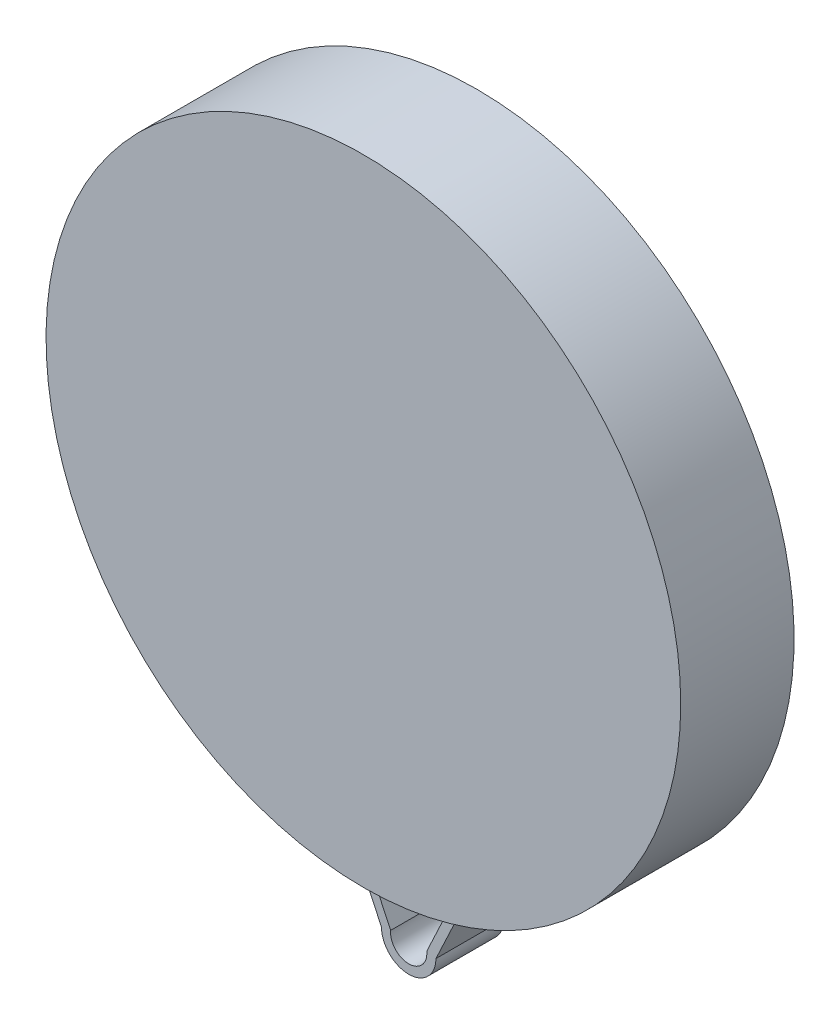
ISO-10303-21;
HEADER;
FILE_DESCRIPTION(('STEP AP214'),'2;1');
FILE_NAME('part.step','',(''),(''),'','','');
FILE_SCHEMA(('AUTOMOTIVE_DESIGN { 1 0 10303 214 1 1 1 1 }'));
ENDSEC;
DATA;
#1=APPLICATION_CONTEXT('core data for automotive mechanical design processes');
#2=APPLICATION_PROTOCOL_DEFINITION('international standard','automotive_design',2000,#1);
#3=PRODUCT_CONTEXT('',#1,'mechanical');
#4=PRODUCT('Part','Part','',(#3));
#5=PRODUCT_RELATED_PRODUCT_CATEGORY('part','',(#4));
#6=PRODUCT_DEFINITION_FORMATION('','',#4);
#7=PRODUCT_DEFINITION_CONTEXT('part definition',#1,'design');
#8=PRODUCT_DEFINITION('design','',#6,#7);
#9=PRODUCT_DEFINITION_SHAPE('','',#8);
#10=(LENGTH_UNIT() NAMED_UNIT(*) SI_UNIT(.MILLI.,.METRE.));
#11=(NAMED_UNIT(*) PLANE_ANGLE_UNIT() SI_UNIT($,.RADIAN.));
#12=(NAMED_UNIT(*) SI_UNIT($,.STERADIAN.) SOLID_ANGLE_UNIT());
#13=UNCERTAINTY_MEASURE_WITH_UNIT(LENGTH_MEASURE(1.E-05),#10,'distance_accuracy_value','');
#14=(GEOMETRIC_REPRESENTATION_CONTEXT(3) GLOBAL_UNCERTAINTY_ASSIGNED_CONTEXT((#13)) GLOBAL_UNIT_ASSIGNED_CONTEXT((#10,
#11,#12)) REPRESENTATION_CONTEXT('',''));
#15=CARTESIAN_POINT('',(0.,0.,0.));
#16=DIRECTION('',(0.,0.,1.));
#17=DIRECTION('',(1.,0.,0.));
#18=AXIS2_PLACEMENT_3D('',#15,#16,#17);
#19=CARTESIAN_POINT('',(0.,-85.59,-0.000999999999999265));
#20=DIRECTION('',(0.,0.,1.));
#21=DIRECTION('',(1.,0.,0.));
#22=AXIS2_PLACEMENT_3D('',#19,#20,#21);
#23=CYLINDRICAL_SURFACE('',#22,3.);
#24=CARTESIAN_POINT('',(0.,-85.59,0.));
#25=DIRECTION('',(0.,0.,1.));
#26=DIRECTION('',(1.,0.,0.));
#27=AXIS2_PLACEMENT_3D('',#24,#25,#26);
#28=CIRCLE('',#27,3.);
#29=CARTESIAN_POINT('',(3.,-85.59,0.));
#30=VERTEX_POINT('',#29);
#31=EDGE_CURVE('E155',#30,#30,#28,.F.);
#32=CARTESIAN_POINT('',(0.,-85.59,2.));
#33=DIRECTION('',(0.,0.,1.));
#34=DIRECTION('',(1.,0.,0.));
#35=AXIS2_PLACEMENT_3D('',#32,#33,#34);
#36=CIRCLE('',#35,3.);
#37=CARTESIAN_POINT('',(3.,-85.59,2.));
#38=VERTEX_POINT('',#37);
#39=EDGE_CURVE('E152',#38,#38,#36,.F.);
#40=CARTESIAN_POINT('',(3.,-85.59,0.));
#41=CARTESIAN_POINT('',(3.,-85.59,0.0208333333333334));
#42=CARTESIAN_POINT('',(3.,-85.59,0.0416666666666667));
#43=CARTESIAN_POINT('',(3.,-85.59,0.0833333333333333));
#44=CARTESIAN_POINT('',(3.,-85.59,0.104166666666667));
#45=CARTESIAN_POINT('',(3.,-85.59,0.145833333333333));
#46=CARTESIAN_POINT('',(3.,-85.59,0.166666666666667));
#47=CARTESIAN_POINT('',(3.,-85.59,0.208333333333333));
#48=CARTESIAN_POINT('',(3.,-85.59,0.229166666666667));
#49=CARTESIAN_POINT('',(3.,-85.59,0.270833333333333));
#50=CARTESIAN_POINT('',(3.,-85.59,0.291666666666667));
#51=CARTESIAN_POINT('',(3.,-85.59,0.333333333333333));
#52=CARTESIAN_POINT('',(3.,-85.59,0.354166666666667));
#53=CARTESIAN_POINT('',(3.,-85.59,0.395833333333333));
#54=CARTESIAN_POINT('',(3.,-85.59,0.416666666666667));
#55=CARTESIAN_POINT('',(3.,-85.59,0.458333333333333));
#56=CARTESIAN_POINT('',(3.,-85.59,0.479166666666667));
#57=CARTESIAN_POINT('',(3.,-85.59,0.520833333333333));
#58=CARTESIAN_POINT('',(3.,-85.59,0.541666666666667));
#59=CARTESIAN_POINT('',(3.,-85.59,0.583333333333333));
#60=CARTESIAN_POINT('',(3.,-85.59,0.604166666666667));
#61=CARTESIAN_POINT('',(3.,-85.59,0.645833333333333));
#62=CARTESIAN_POINT('',(3.,-85.59,0.666666666666667));
#63=CARTESIAN_POINT('',(3.,-85.59,0.708333333333333));
#64=CARTESIAN_POINT('',(3.,-85.59,0.729166666666667));
#65=CARTESIAN_POINT('',(3.,-85.59,0.770833333333333));
#66=CARTESIAN_POINT('',(3.,-85.59,0.791666666666667));
#67=CARTESIAN_POINT('',(3.,-85.59,0.833333333333333));
#68=CARTESIAN_POINT('',(3.,-85.59,0.854166666666667));
#69=CARTESIAN_POINT('',(3.,-85.59,0.895833333333333));
#70=CARTESIAN_POINT('',(3.,-85.59,0.916666666666667));
#71=CARTESIAN_POINT('',(3.,-85.59,0.958333333333333));
#72=CARTESIAN_POINT('',(3.,-85.59,0.979166666666666));
#73=CARTESIAN_POINT('',(3.,-85.59,1.02083333333333));
#74=CARTESIAN_POINT('',(3.,-85.59,1.04166666666667));
#75=CARTESIAN_POINT('',(3.,-85.59,1.08333333333333));
#76=CARTESIAN_POINT('',(3.,-85.59,1.10416666666667));
#77=CARTESIAN_POINT('',(3.,-85.59,1.14583333333333));
#78=CARTESIAN_POINT('',(3.,-85.59,1.16666666666667));
#79=CARTESIAN_POINT('',(3.,-85.59,1.20833333333333));
#80=CARTESIAN_POINT('',(3.,-85.59,1.22916666666667));
#81=CARTESIAN_POINT('',(3.,-85.59,1.27083333333333));
#82=CARTESIAN_POINT('',(3.,-85.59,1.29166666666667));
#83=CARTESIAN_POINT('',(3.,-85.59,1.33333333333333));
#84=CARTESIAN_POINT('',(3.,-85.59,1.35416666666667));
#85=CARTESIAN_POINT('',(3.,-85.59,1.39583333333333));
#86=CARTESIAN_POINT('',(3.,-85.59,1.41666666666667));
#87=CARTESIAN_POINT('',(3.,-85.59,1.45833333333333));
#88=CARTESIAN_POINT('',(3.,-85.59,1.47916666666667));
#89=CARTESIAN_POINT('',(3.,-85.59,1.52083333333333));
#90=CARTESIAN_POINT('',(3.,-85.59,1.54166666666667));
#91=CARTESIAN_POINT('',(3.,-85.59,1.58333333333333));
#92=CARTESIAN_POINT('',(3.,-85.59,1.60416666666667));
#93=CARTESIAN_POINT('',(3.,-85.59,1.64583333333333));
#94=CARTESIAN_POINT('',(3.,-85.59,1.66666666666667));
#95=CARTESIAN_POINT('',(3.,-85.59,1.70833333333333));
#96=CARTESIAN_POINT('',(3.,-85.59,1.72916666666667));
#97=CARTESIAN_POINT('',(3.,-85.59,1.77083333333333));
#98=CARTESIAN_POINT('',(3.,-85.59,1.79166666666667));
#99=CARTESIAN_POINT('',(3.,-85.59,1.83333333333333));
#100=CARTESIAN_POINT('',(3.,-85.59,1.85416666666667));
#101=CARTESIAN_POINT('',(3.,-85.59,1.89583333333333));
#102=CARTESIAN_POINT('',(3.,-85.59,1.91666666666667));
#103=CARTESIAN_POINT('',(3.,-85.59,1.95833333333333));
#104=CARTESIAN_POINT('',(3.,-85.59,1.97916666666667));
#105=CARTESIAN_POINT('',(3.,-85.59,2.));
#106=B_SPLINE_CURVE_WITH_KNOTS('',3,(#40,#41,#42,#43,#44,#45,#46,#47,#48,#49,#50,#51,#52,#53,
#54,#55,#56,#57,#58,#59,#60,#61,#62,#63,#64,#65,#66,#67,#68,#69,#70,#71,#72,#73,#74,#75,#76,#77,
#78,#79,#80,#81,#82,#83,#84,#85,#86,#87,#88,#89,#90,#91,#92,#93,#94,#95,#96,#97,#98,#99,#100,
#101,#102,#103,#104,#105),.UNSPECIFIED.,.F.,.F.,(4,2,2,2,2,2,2,2,2,2,2,2,2,2,2,2,2,2,2,2,2,2,2,
2,2,2,2,2,2,2,2,2,4),(0.,0.0625,0.125,0.1875,0.25,0.3125,0.375,0.4375,0.5,0.5625,0.625,0.6875,
0.75,0.8125,0.875,0.9375,1.,1.0625,1.125,1.1875,1.25,1.3125,1.375,1.4375,1.5,1.5625,1.625,
1.6875,1.75,1.8125,1.875,1.9375,2.),.UNSPECIFIED.);
#107=EDGE_CURVE('BSEAM37',#30,#38,#106,.T.);
#108=ORIENTED_EDGE('',*,*,#31,.T.);
#109=ORIENTED_EDGE('',*,*,#39,.F.);
#110=ORIENTED_EDGE('',*,*,#107,.T.);
#111=ORIENTED_EDGE('',*,*,#107,.F.);
#112=EDGE_LOOP('',(#108,#110,#109,#111));
#113=FACE_BOUND('',#112,.T.);
#114=ADVANCED_FACE('F37',(#113),#23,.F.);
#115=CARTESIAN_POINT('',(0.,0.,25.));
#116=DIRECTION('',(0.,0.,-1.));
#117=DIRECTION('',(-1.,0.,0.));
#118=AXIS2_PLACEMENT_3D('',#115,#116,#117);
#119=CYLINDRICAL_SURFACE('',#118,70.);
#120=CARTESIAN_POINT('',(0.,0.,25.));
#121=DIRECTION('',(0.,0.,1.));
#122=DIRECTION('',(1.,0.,0.));
#123=AXIS2_PLACEMENT_3D('',#120,#121,#122);
#124=CIRCLE('',#123,70.);
#125=CARTESIAN_POINT('',(70.,0.,25.));
#126=VERTEX_POINT('',#125);
#127=EDGE_CURVE('E11',#126,#126,#124,.T.);
#128=ORIENTED_EDGE('',*,*,#127,.F.);
#129=EDGE_LOOP('',(#128));
#130=FACE_BOUND('',#129,.T.);
#131=DIRECTION('',(0.,0.,-1.));
#132=VECTOR('',#131,1.);
#133=CARTESIAN_POINT('',(13.9789806495325,-68.59,15.));
#134=LINE('',#133,#132);
#135=CARTESIAN_POINT('',(13.9789806495325,-68.59,15.));
#136=VERTEX_POINT('',#135);
#137=CARTESIAN_POINT('',(13.9789806495325,-68.59,0.));
#138=VERTEX_POINT('',#137);
#139=EDGE_CURVE('E183',#136,#138,#134,.T.);
#140=ORIENTED_EDGE('',*,*,#139,.T.);
#141=CARTESIAN_POINT('',(0.,0.,0.));
#142=DIRECTION('',(0.,0.,1.));
#143=DIRECTION('',(1.,0.,0.));
#144=AXIS2_PLACEMENT_3D('',#141,#142,#143);
#145=CIRCLE('',#144,70.);
#146=CARTESIAN_POINT('',(-13.9789806495325,-68.59,0.));
#147=VERTEX_POINT('',#146);
#148=EDGE_CURVE('E41',#138,#147,#145,.T.);
#149=ORIENTED_EDGE('',*,*,#148,.T.);
#150=DIRECTION('',(0.,0.,-1.));
#151=VECTOR('',#150,1.);
#152=CARTESIAN_POINT('',(-13.9789806495325,-68.59,15.));
#153=LINE('',#152,#151);
#154=CARTESIAN_POINT('',(-13.9789806495325,-68.59,15.));
#155=VERTEX_POINT('',#154);
#156=EDGE_CURVE('E180',#155,#147,#153,.T.);
#157=ORIENTED_EDGE('',*,*,#156,.F.);
#158=CARTESIAN_POINT('',(0.,0.,15.));
#159=DIRECTION('',(0.,0.,1.));
#160=DIRECTION('',(1.,0.,0.));
#161=AXIS2_PLACEMENT_3D('',#158,#159,#160);
#162=CIRCLE('',#161,70.);
#163=CARTESIAN_POINT('',(-11.5588757903887,-69.0390642351297,15.));
#164=VERTEX_POINT('',#163);
#165=EDGE_CURVE('E165',#164,#155,#162,.F.);
#166=ORIENTED_EDGE('',*,*,#165,.F.);
#167=CARTESIAN_POINT('',(11.5588757903887,-69.0390642351298,15.));
#168=VERTEX_POINT('',#167);
#169=EDGE_CURVE('E168',#168,#164,#162,.F.);
#170=ORIENTED_EDGE('',*,*,#169,.F.);
#171=EDGE_CURVE('E60',#136,#168,#162,.F.);
#172=ORIENTED_EDGE('',*,*,#171,.F.);
#173=EDGE_LOOP('',(#140,#149,#157,#166,#170,#172));
#174=FACE_BOUND('',#173,.T.);
#175=ADVANCED_FACE('F39',(#130,#174),#119,.T.);
#176=CARTESIAN_POINT('',(0.,0.,25.));
#177=DIRECTION('',(0.,0.,1.));
#178=DIRECTION('',(1.,0.,0.));
#179=AXIS2_PLACEMENT_3D('',#176,#177,#178);
#180=PLANE('',#179);
#181=ORIENTED_EDGE('',*,*,#127,.T.);
#182=EDGE_LOOP('',(#181));
#183=FACE_BOUND('',#182,.T.);
#184=ADVANCED_FACE('F223',(#183),#180,.T.);
#185=CARTESIAN_POINT('',(0.,0.,0.));
#186=DIRECTION('',(0.,0.,1.));
#187=DIRECTION('',(1.,0.,0.));
#188=AXIS2_PLACEMENT_3D('',#185,#186,#187);
#189=PLANE('',#188);
#190=ORIENTED_EDGE('',*,*,#31,.F.);
#191=EDGE_LOOP('',(#190));
#192=FACE_BOUND('',#191,.T.);
#193=ORIENTED_EDGE('',*,*,#148,.F.);
#194=DIRECTION('',(0.424880467128531,0.905249462111213,0.));
#195=VECTOR('',#194,1.);
#196=CARTESIAN_POINT('',(37.8367262103918,-17.7587356631985,0.));
#197=LINE('',#196,#195);
#198=CARTESIAN_POINT('',(6.00000000000001,-85.59,0.));
#199=VERTEX_POINT('',#198);
#200=EDGE_CURVE('E174',#199,#138,#197,.T.);
#201=ORIENTED_EDGE('',*,*,#200,.F.);
#202=CARTESIAN_POINT('',(0.,-85.59,0.));
#203=DIRECTION('',(0.,0.,1.));
#204=DIRECTION('',(1.,0.,0.));
#205=AXIS2_PLACEMENT_3D('',#202,#203,#204);
#206=CIRCLE('',#205,6.00000000000001);
#207=CARTESIAN_POINT('',(-6.00000000000001,-85.59,0.));
#208=VERTEX_POINT('',#207);
#209=EDGE_CURVE('E158',#208,#199,#206,.T.);
#210=ORIENTED_EDGE('',*,*,#209,.F.);
#211=DIRECTION('',(-0.424880467128531,0.905249462111213,0.));
#212=VECTOR('',#211,1.);
#213=CARTESIAN_POINT('',(-37.8367262103918,-17.7587356631985,0.));
#214=LINE('',#213,#212);
#215=EDGE_CURVE('E163',#208,#147,#214,.T.);
#216=ORIENTED_EDGE('',*,*,#215,.T.);
#217=EDGE_LOOP('',(#193,#201,#210,#216));
#218=FACE_BOUND('',#217,.T.);
#219=ADVANCED_FACE('F198',(#192,#218),#189,.F.);
#220=CARTESIAN_POINT('',(0.,-85.59,15.));
#221=DIRECTION('',(0.,0.,-1.));
#222=DIRECTION('',(-1.,0.,0.));
#223=AXIS2_PLACEMENT_3D('',#220,#221,#222);
#224=CYLINDRICAL_SURFACE('',#223,6.00000000000001);
#225=ORIENTED_EDGE('',*,*,#209,.T.);
#226=DIRECTION('',(0.,0.,-1.));
#227=VECTOR('',#226,1.);
#228=CARTESIAN_POINT('',(6.00000000000001,-85.59,15.));
#229=LINE('',#228,#227);
#230=CARTESIAN_POINT('',(6.00000000000001,-85.59,15.));
#231=VERTEX_POINT('',#230);
#232=EDGE_CURVE('E185',#231,#199,#229,.T.);
#233=ORIENTED_EDGE('',*,*,#232,.F.);
#234=CARTESIAN_POINT('',(0.,-85.59,15.));
#235=DIRECTION('',(0.,0.,1.));
#236=DIRECTION('',(1.,0.,0.));
#237=AXIS2_PLACEMENT_3D('',#234,#235,#236);
#238=CIRCLE('',#237,6.00000000000001);
#239=CARTESIAN_POINT('',(-6.00000000000001,-85.59,15.));
#240=VERTEX_POINT('',#239);
#241=EDGE_CURVE('E159',#240,#231,#238,.T.);
#242=ORIENTED_EDGE('',*,*,#241,.F.);
#243=DIRECTION('',(0.,0.,-1.));
#244=VECTOR('',#243,1.);
#245=CARTESIAN_POINT('',(-6.00000000000001,-85.59,15.));
#246=LINE('',#245,#244);
#247=EDGE_CURVE('E171',#240,#208,#246,.T.);
#248=ORIENTED_EDGE('',*,*,#247,.T.);
#249=EDGE_LOOP('',(#225,#233,#242,#248));
#250=FACE_BOUND('',#249,.T.);
#251=ADVANCED_FACE('F200',(#250),#224,.T.);
#252=CARTESIAN_POINT('',(37.8367262103918,-17.7587356631985,15.));
#253=DIRECTION('',(-0.905249462111213,0.424880467128532,0.));
#254=DIRECTION('',(-0.424880467128532,-0.905249462111213,0.));
#255=AXIS2_PLACEMENT_3D('',#252,#253,#254);
#256=PLANE('',#255);
#257=ORIENTED_EDGE('',*,*,#200,.T.);
#258=ORIENTED_EDGE('',*,*,#139,.F.);
#259=DIRECTION('',(0.424880467128531,0.905249462111213,0.));
#260=VECTOR('',#259,1.);
#261=CARTESIAN_POINT('',(37.8367262103918,-17.7587356631985,15.));
#262=LINE('',#261,#260);
#263=EDGE_CURVE('E162',#231,#136,#262,.T.);
#264=ORIENTED_EDGE('',*,*,#263,.F.);
#265=ORIENTED_EDGE('',*,*,#232,.T.);
#266=EDGE_LOOP('',(#257,#258,#264,#265));
#267=FACE_BOUND('',#266,.T.);
#268=ADVANCED_FACE('F208',(#267),#256,.F.);
#269=CARTESIAN_POINT('',(-37.8367262103918,-17.7587356631985,15.));
#270=DIRECTION('',(-0.905249462111213,-0.424880467128532,0.));
#271=DIRECTION('',(0.424880467128532,-0.905249462111213,0.));
#272=AXIS2_PLACEMENT_3D('',#269,#270,#271);
#273=PLANE('',#272);
#274=ORIENTED_EDGE('',*,*,#215,.F.);
#275=ORIENTED_EDGE('',*,*,#247,.F.);
#276=DIRECTION('',(-0.424880467128531,0.905249462111213,0.));
#277=VECTOR('',#276,1.);
#278=CARTESIAN_POINT('',(-37.8367262103918,-17.7587356631985,15.));
#279=LINE('',#278,#277);
#280=EDGE_CURVE('E167',#240,#155,#279,.T.);
#281=ORIENTED_EDGE('',*,*,#280,.T.);
#282=ORIENTED_EDGE('',*,*,#156,.T.);
#283=EDGE_LOOP('',(#274,#275,#281,#282));
#284=FACE_BOUND('',#283,.T.);
#285=ADVANCED_FACE('F195',(#284),#273,.T.);
#286=CARTESIAN_POINT('',(0.,0.,15.));
#287=DIRECTION('',(0.,0.,1.));
#288=DIRECTION('',(1.,0.,0.));
#289=AXIS2_PLACEMENT_3D('',#286,#287,#288);
#290=PLANE('',#289);
#291=DIRECTION('',(0.424880467128532,0.905249462111213,0.));
#292=VECTOR('',#291,1.);
#293=CARTESIAN_POINT('',(36.0262272861694,-16.9089747289414,15.));
#294=LINE('',#293,#292);
#295=CARTESIAN_POINT('',(3.9796765332102,-85.1872908108621,15.));
#296=VERTEX_POINT('',#295);
#297=EDGE_CURVE('E147',#296,#168,#294,.T.);
#298=ORIENTED_EDGE('',*,*,#297,.F.);
#299=CARTESIAN_POINT('',(0.,-85.59,15.));
#300=DIRECTION('',(0.,0.,1.));
#301=DIRECTION('',(1.,0.,0.));
#302=AXIS2_PLACEMENT_3D('',#299,#300,#301);
#303=CIRCLE('',#302,4.00000000000001);
#304=CARTESIAN_POINT('',(-3.9796765332102,-85.1872908108621,15.));
#305=VERTEX_POINT('',#304);
#306=EDGE_CURVE('E134',#305,#296,#303,.T.);
#307=ORIENTED_EDGE('',*,*,#306,.F.);
#308=DIRECTION('',(-0.424880467128532,0.905249462111213,0.));
#309=VECTOR('',#308,1.);
#310=CARTESIAN_POINT('',(-36.0262272861694,-16.9089747289414,15.));
#311=LINE('',#310,#309);
#312=EDGE_CURVE('E145',#305,#164,#311,.T.);
#313=ORIENTED_EDGE('',*,*,#312,.T.);
#314=ORIENTED_EDGE('',*,*,#165,.T.);
#315=ORIENTED_EDGE('',*,*,#280,.F.);
#316=ORIENTED_EDGE('',*,*,#241,.T.);
#317=ORIENTED_EDGE('',*,*,#263,.T.);
#318=ORIENTED_EDGE('',*,*,#171,.T.);
#319=EDGE_LOOP('',(#298,#307,#313,#314,#315,#316,#317,#318));
#320=FACE_BOUND('',#319,.T.);
#321=ADVANCED_FACE('F204',(#320),#290,.T.);
#322=CARTESIAN_POINT('',(0.,0.,25.));
#323=DIRECTION('',(0.,0.,-1.));
#324=DIRECTION('',(-1.,0.,0.));
#325=AXIS2_PLACEMENT_3D('',#322,#323,#324);
#326=CYLINDRICAL_SURFACE('',#325,68.);
#327=CARTESIAN_POINT('',(0.,0.,23.));
#328=DIRECTION('',(0.,0.,1.));
#329=DIRECTION('',(1.,0.,0.));
#330=AXIS2_PLACEMENT_3D('',#327,#328,#329);
#331=CIRCLE('',#330,68.);
#332=CARTESIAN_POINT('',(68.,0.,23.));
#333=VERTEX_POINT('',#332);
#334=EDGE_CURVE('E121',#333,#333,#331,.T.);
#335=ORIENTED_EDGE('',*,*,#334,.T.);
#336=EDGE_LOOP('',(#335));
#337=FACE_BOUND('',#336,.T.);
#338=DIRECTION('',(0.,0.,-1.));
#339=VECTOR('',#338,1.);
#340=CARTESIAN_POINT('',(12.5991739570328,-66.8226070697667,15.));
#341=LINE('',#340,#339);
#342=CARTESIAN_POINT('',(12.5991739570328,-66.8226070697667,15.));
#343=VERTEX_POINT('',#342);
#344=CARTESIAN_POINT('',(12.5991739570328,-66.8226070697667,2.));
#345=VERTEX_POINT('',#344);
#346=EDGE_CURVE('E129',#343,#345,#341,.T.);
#347=ORIENTED_EDGE('',*,*,#346,.F.);
#348=CARTESIAN_POINT('',(0.,0.,15.));
#349=DIRECTION('',(0.,0.,1.));
#350=DIRECTION('',(1.,0.,0.));
#351=AXIS2_PLACEMENT_3D('',#348,#349,#350);
#352=CIRCLE('',#351,68.);
#353=CARTESIAN_POINT('',(-12.5991739570328,-66.8226070697667,15.));
#354=VERTEX_POINT('',#353);
#355=EDGE_CURVE('E128',#343,#354,#352,.F.);
#356=ORIENTED_EDGE('',*,*,#355,.T.);
#357=DIRECTION('',(0.,0.,-1.));
#358=VECTOR('',#357,1.);
#359=CARTESIAN_POINT('',(-12.5991739570328,-66.8226070697667,15.));
#360=LINE('',#359,#358);
#361=CARTESIAN_POINT('',(-12.5991739570328,-66.8226070697667,2.));
#362=VERTEX_POINT('',#361);
#363=EDGE_CURVE('E125',#354,#362,#360,.T.);
#364=ORIENTED_EDGE('',*,*,#363,.T.);
#365=CARTESIAN_POINT('',(0.,0.,2.));
#366=DIRECTION('',(0.,0.,1.));
#367=DIRECTION('',(1.,0.,0.));
#368=AXIS2_PLACEMENT_3D('',#365,#366,#367);
#369=CIRCLE('',#368,68.);
#370=EDGE_CURVE('E111',#345,#362,#369,.T.);
#371=ORIENTED_EDGE('',*,*,#370,.F.);
#372=EDGE_LOOP('',(#347,#356,#364,#371));
#373=FACE_BOUND('',#372,.T.);
#374=ADVANCED_FACE('F126',(#337,#373),#326,.F.);
#375=CARTESIAN_POINT('',(0.,0.,23.));
#376=DIRECTION('',(0.,0.,1.));
#377=DIRECTION('',(1.,0.,0.));
#378=AXIS2_PLACEMENT_3D('',#375,#376,#377);
#379=PLANE('',#378);
#380=ORIENTED_EDGE('',*,*,#334,.F.);
#381=EDGE_LOOP('',(#380));
#382=FACE_BOUND('',#381,.T.);
#383=ADVANCED_FACE('F233',(#382),#379,.F.);
#384=CARTESIAN_POINT('',(0.,0.,2.));
#385=DIRECTION('',(0.,0.,1.));
#386=DIRECTION('',(1.,0.,0.));
#387=AXIS2_PLACEMENT_3D('',#384,#385,#386);
#388=PLANE('',#387);
#389=ORIENTED_EDGE('',*,*,#39,.T.);
#390=EDGE_LOOP('',(#389));
#391=FACE_BOUND('',#390,.T.);
#392=ORIENTED_EDGE('',*,*,#370,.T.);
#393=DIRECTION('',(-0.424880467128532,0.905249462111213,0.));
#394=VECTOR('',#393,1.);
#395=CARTESIAN_POINT('',(-36.0262272861694,-16.9089747289414,2.));
#396=LINE('',#395,#394);
#397=CARTESIAN_POINT('',(-3.9796765332102,-85.1872908108621,2.));
#398=VERTEX_POINT('',#397);
#399=EDGE_CURVE('E116',#398,#362,#396,.T.);
#400=ORIENTED_EDGE('',*,*,#399,.F.);
#401=CARTESIAN_POINT('',(0.,-85.59,2.));
#402=DIRECTION('',(0.,0.,1.));
#403=DIRECTION('',(1.,0.,0.));
#404=AXIS2_PLACEMENT_3D('',#401,#402,#403);
#405=CIRCLE('',#404,4.00000000000001);
#406=CARTESIAN_POINT('',(3.9796765332102,-85.1872908108621,2.));
#407=VERTEX_POINT('',#406);
#408=EDGE_CURVE('E138',#398,#407,#405,.T.);
#409=ORIENTED_EDGE('',*,*,#408,.T.);
#410=DIRECTION('',(0.424880467128532,0.905249462111213,0.));
#411=VECTOR('',#410,1.);
#412=CARTESIAN_POINT('',(36.0262272861694,-16.9089747289414,2.));
#413=LINE('',#412,#411);
#414=EDGE_CURVE('E117',#407,#345,#413,.T.);
#415=ORIENTED_EDGE('',*,*,#414,.T.);
#416=EDGE_LOOP('',(#392,#400,#409,#415));
#417=FACE_BOUND('',#416,.T.);
#418=ADVANCED_FACE('F113',(#391,#417),#388,.T.);
#419=CARTESIAN_POINT('',(0.,-85.59,15.));
#420=DIRECTION('',(0.,0.,-1.));
#421=DIRECTION('',(-1.,0.,0.));
#422=AXIS2_PLACEMENT_3D('',#419,#420,#421);
#423=CYLINDRICAL_SURFACE('',#422,4.00000000000001);
#424=ORIENTED_EDGE('',*,*,#408,.F.);
#425=DIRECTION('',(0.,0.,-1.));
#426=VECTOR('',#425,1.);
#427=CARTESIAN_POINT('',(-3.9796765332102,-85.1872908108621,15.));
#428=LINE('',#427,#426);
#429=EDGE_CURVE('E130',#305,#398,#428,.T.);
#430=ORIENTED_EDGE('',*,*,#429,.F.);
#431=ORIENTED_EDGE('',*,*,#306,.T.);
#432=DIRECTION('',(0.,0.,-1.));
#433=VECTOR('',#432,1.);
#434=CARTESIAN_POINT('',(3.9796765332102,-85.1872908108621,15.));
#435=LINE('',#434,#433);
#436=EDGE_CURVE('E122',#296,#407,#435,.T.);
#437=ORIENTED_EDGE('',*,*,#436,.T.);
#438=EDGE_LOOP('',(#424,#430,#431,#437));
#439=FACE_BOUND('',#438,.T.);
#440=ADVANCED_FACE('F246',(#439),#423,.F.);
#441=CARTESIAN_POINT('',(36.0262272861694,-16.9089747289414,15.));
#442=DIRECTION('',(-0.905249462111213,0.424880467128532,0.));
#443=DIRECTION('',(-0.424880467128532,-0.905249462111213,0.));
#444=AXIS2_PLACEMENT_3D('',#441,#442,#443);
#445=PLANE('',#444);
#446=ORIENTED_EDGE('',*,*,#414,.F.);
#447=ORIENTED_EDGE('',*,*,#436,.F.);
#448=ORIENTED_EDGE('',*,*,#297,.T.);
#449=EDGE_CURVE('E136',#168,#343,#294,.T.);
#450=ORIENTED_EDGE('',*,*,#449,.T.);
#451=ORIENTED_EDGE('',*,*,#346,.T.);
#452=EDGE_LOOP('',(#446,#447,#448,#450,#451));
#453=FACE_BOUND('',#452,.T.);
#454=ADVANCED_FACE('F249',(#453),#445,.T.);
#455=CARTESIAN_POINT('',(-36.0262272861694,-16.9089747289414,15.));
#456=DIRECTION('',(-0.905249462111213,-0.424880467128532,0.));
#457=DIRECTION('',(0.424880467128532,-0.905249462111213,0.));
#458=AXIS2_PLACEMENT_3D('',#455,#456,#457);
#459=PLANE('',#458);
#460=ORIENTED_EDGE('',*,*,#399,.T.);
#461=ORIENTED_EDGE('',*,*,#363,.F.);
#462=EDGE_CURVE('E52',#164,#354,#311,.T.);
#463=ORIENTED_EDGE('',*,*,#462,.F.);
#464=ORIENTED_EDGE('',*,*,#312,.F.);
#465=ORIENTED_EDGE('',*,*,#429,.T.);
#466=EDGE_LOOP('',(#460,#461,#463,#464,#465));
#467=FACE_BOUND('',#466,.T.);
#468=ADVANCED_FACE('F132',(#467),#459,.F.);
#469=CARTESIAN_POINT('',(0.,0.,15.));
#470=DIRECTION('',(0.,0.,1.));
#471=DIRECTION('',(1.,0.,0.));
#472=AXIS2_PLACEMENT_3D('',#469,#470,#471);
#473=PLANE('',#472);
#474=ORIENTED_EDGE('',*,*,#169,.T.);
#475=ORIENTED_EDGE('',*,*,#462,.T.);
#476=ORIENTED_EDGE('',*,*,#355,.F.);
#477=ORIENTED_EDGE('',*,*,#449,.F.);
#478=EDGE_LOOP('',(#474,#475,#476,#477));
#479=FACE_BOUND('',#478,.T.);
#480=ADVANCED_FACE('F207',(#479),#473,.F.);
#481=CLOSED_SHELL('',(#114,#175,#184,#219,#251,#268,#285,#321,#374,#383,#418,#440,#454,#468,#480));
#482=MANIFOLD_SOLID_BREP('B2',#481);
#483=ADVANCED_BREP_SHAPE_REPRESENTATION('',(#18,#482),#14);
#484=SHAPE_DEFINITION_REPRESENTATION(#9,#483);
ENDSEC;
END-ISO-10303-21;
